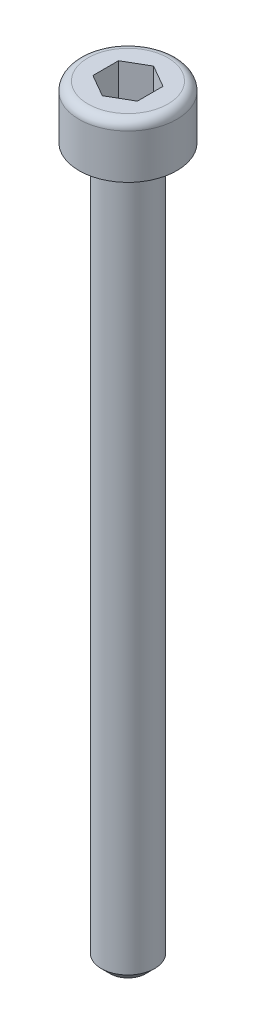
ISO-10303-21;
HEADER;
FILE_DESCRIPTION(('STEP AP214'),'2;1');
FILE_NAME('part.step','',(''),(''),'','','');
FILE_SCHEMA(('AUTOMOTIVE_DESIGN { 1 0 10303 214 1 1 1 1 }'));
ENDSEC;
DATA;
#1=APPLICATION_CONTEXT('core data for automotive mechanical design processes');
#2=APPLICATION_PROTOCOL_DEFINITION('international standard','automotive_design',2000,#1);
#3=PRODUCT_CONTEXT('',#1,'mechanical');
#4=PRODUCT('Part','Part','',(#3));
#5=PRODUCT_RELATED_PRODUCT_CATEGORY('part','',(#4));
#6=PRODUCT_DEFINITION_FORMATION('','',#4);
#7=PRODUCT_DEFINITION_CONTEXT('part definition',#1,'design');
#8=PRODUCT_DEFINITION('design','',#6,#7);
#9=PRODUCT_DEFINITION_SHAPE('','',#8);
#10=(LENGTH_UNIT() NAMED_UNIT(*) SI_UNIT(.MILLI.,.METRE.));
#11=(NAMED_UNIT(*) PLANE_ANGLE_UNIT() SI_UNIT($,.RADIAN.));
#12=(NAMED_UNIT(*) SI_UNIT($,.STERADIAN.) SOLID_ANGLE_UNIT());
#13=UNCERTAINTY_MEASURE_WITH_UNIT(LENGTH_MEASURE(1.E-05),#10,'distance_accuracy_value','');
#14=(GEOMETRIC_REPRESENTATION_CONTEXT(3) GLOBAL_UNCERTAINTY_ASSIGNED_CONTEXT((#13)) GLOBAL_UNIT_ASSIGNED_CONTEXT((#10,
#11,#12)) REPRESENTATION_CONTEXT('',''));
#15=CARTESIAN_POINT('',(0.,0.,0.));
#16=DIRECTION('',(0.,0.,1.));
#17=DIRECTION('',(1.,0.,0.));
#18=AXIS2_PLACEMENT_3D('',#15,#16,#17);
#19=CARTESIAN_POINT('',(0.,0.,0.));
#20=DIRECTION('',(0.,-1.,0.));
#21=DIRECTION('',(0.,0.,-1.));
#22=AXIS2_PLACEMENT_3D('',#19,#20,#21);
#23=PLANE('',#22);
#24=CARTESIAN_POINT('',(0.,0.,0.));
#25=DIRECTION('',(0.,-1.,0.));
#26=DIRECTION('',(0.,0.,-1.));
#27=AXIS2_PLACEMENT_3D('',#24,#25,#26);
#28=CIRCLE('',#27,2.25);
#29=CARTESIAN_POINT('',(0.,0.,-2.25));
#30=VERTEX_POINT('',#29);
#31=EDGE_CURVE('E42',#30,#30,#28,.F.);
#32=ORIENTED_EDGE('',*,*,#31,.T.);
#33=EDGE_LOOP('',(#32));
#34=FACE_BOUND('',#33,.T.);
#35=DIRECTION('',(-0.866025403784439,0.,-0.5));
#36=VECTOR('',#35,1.);
#37=CARTESIAN_POINT('',(1.25,0.,-0.721687836487032));
#38=LINE('',#37,#36);
#39=CARTESIAN_POINT('',(1.25,0.,-0.721687836487032));
#40=VERTEX_POINT('',#39);
#41=CARTESIAN_POINT('',(0.,0.,-1.44337567297406));
#42=VERTEX_POINT('',#41);
#43=EDGE_CURVE('E123',#40,#42,#38,.T.);
#44=ORIENTED_EDGE('',*,*,#43,.F.);
#45=DIRECTION('',(0.,0.,-1.));
#46=VECTOR('',#45,1.);
#47=CARTESIAN_POINT('',(1.25,0.,0.721687836487033));
#48=LINE('',#47,#46);
#49=CARTESIAN_POINT('',(1.25,0.,0.721687836487033));
#50=VERTEX_POINT('',#49);
#51=EDGE_CURVE('E49',#50,#40,#48,.T.);
#52=ORIENTED_EDGE('',*,*,#51,.F.);
#53=DIRECTION('',(0.866025403784439,0.,-0.5));
#54=VECTOR('',#53,1.);
#55=CARTESIAN_POINT('',(0.,0.,1.44337567297406));
#56=LINE('',#55,#54);
#57=CARTESIAN_POINT('',(0.,0.,1.44337567297406));
#58=VERTEX_POINT('',#57);
#59=EDGE_CURVE('E132',#58,#50,#56,.T.);
#60=ORIENTED_EDGE('',*,*,#59,.F.);
#61=DIRECTION('',(0.866025403784439,0.,0.5));
#62=VECTOR('',#61,1.);
#63=CARTESIAN_POINT('',(-1.25,0.,0.721687836487031));
#64=LINE('',#63,#62);
#65=CARTESIAN_POINT('',(-1.25,0.,0.721687836487031));
#66=VERTEX_POINT('',#65);
#67=EDGE_CURVE('E130',#66,#58,#64,.T.);
#68=ORIENTED_EDGE('',*,*,#67,.F.);
#69=DIRECTION('',(0.,0.,1.));
#70=VECTOR('',#69,1.);
#71=CARTESIAN_POINT('',(-1.25,0.,-0.721687836487033));
#72=LINE('',#71,#70);
#73=CARTESIAN_POINT('',(-1.25,0.,-0.721687836487033));
#74=VERTEX_POINT('',#73);
#75=EDGE_CURVE('E97',#74,#66,#72,.T.);
#76=ORIENTED_EDGE('',*,*,#75,.F.);
#77=DIRECTION('',(-0.866025403784439,0.,0.5));
#78=VECTOR('',#77,1.);
#79=CARTESIAN_POINT('',(0.,0.,-1.44337567297406));
#80=LINE('',#79,#78);
#81=EDGE_CURVE('E126',#42,#74,#80,.T.);
#82=ORIENTED_EDGE('',*,*,#81,.F.);
#83=EDGE_LOOP('',(#44,#52,#60,#68,#76,#82));
#84=FACE_BOUND('',#83,.T.);
#85=ADVANCED_FACE('F34',(#34,#84),#23,.F.);
#86=CARTESIAN_POINT('',(0.,0.,0.));
#87=DIRECTION('',(0.,1.,0.));
#88=DIRECTION('',(0.,0.,1.));
#89=AXIS2_PLACEMENT_3D('',#86,#87,#88);
#90=CYLINDRICAL_SURFACE('',#89,2.75);
#91=CARTESIAN_POINT('',(0.,-0.5,0.));
#92=DIRECTION('',(0.,-1.,0.));
#93=DIRECTION('',(0.,0.,-1.));
#94=AXIS2_PLACEMENT_3D('',#91,#92,#93);
#95=CIRCLE('',#94,2.75);
#96=CARTESIAN_POINT('',(0.,-0.5,-2.75));
#97=VERTEX_POINT('',#96);
#98=EDGE_CURVE('E11',#97,#97,#95,.T.);
#99=ORIENTED_EDGE('',*,*,#98,.T.);
#100=EDGE_LOOP('',(#99));
#101=FACE_BOUND('',#100,.T.);
#102=CARTESIAN_POINT('',(0.,-3.,0.));
#103=DIRECTION('',(0.,1.,0.));
#104=DIRECTION('',(0.,0.,1.));
#105=AXIS2_PLACEMENT_3D('',#102,#103,#104);
#106=CIRCLE('',#105,2.75);
#107=CARTESIAN_POINT('',(0.,-3.,2.75));
#108=VERTEX_POINT('',#107);
#109=EDGE_CURVE('E144',#108,#108,#106,.T.);
#110=ORIENTED_EDGE('',*,*,#109,.T.);
#111=EDGE_LOOP('',(#110));
#112=FACE_BOUND('',#111,.T.);
#113=ADVANCED_FACE('F166',(#101,#112),#90,.T.);
#114=CARTESIAN_POINT('',(2.75,-3.,0.));
#115=DIRECTION('',(0.,1.,0.));
#116=DIRECTION('',(0.,0.,1.));
#117=AXIS2_PLACEMENT_3D('',#114,#115,#116);
#118=PLANE('',#117);
#119=ORIENTED_EDGE('',*,*,#109,.F.);
#120=EDGE_LOOP('',(#119));
#121=FACE_BOUND('',#120,.T.);
#122=CARTESIAN_POINT('',(0.,-3.,0.));
#123=DIRECTION('',(0.,1.,0.));
#124=DIRECTION('',(0.,0.,1.));
#125=AXIS2_PLACEMENT_3D('',#122,#123,#124);
#126=CIRCLE('',#125,1.5);
#127=CARTESIAN_POINT('',(0.,-3.,1.5));
#128=VERTEX_POINT('',#127);
#129=EDGE_CURVE('E136',#128,#128,#126,.T.);
#130=ORIENTED_EDGE('',*,*,#129,.T.);
#131=EDGE_LOOP('',(#130));
#132=FACE_BOUND('',#131,.T.);
#133=ADVANCED_FACE('F171',(#121,#132),#118,.F.);
#134=CARTESIAN_POINT('',(0.,0.,0.));
#135=DIRECTION('',(0.,1.,0.));
#136=DIRECTION('',(0.,0.,1.));
#137=AXIS2_PLACEMENT_3D('',#134,#135,#136);
#138=CYLINDRICAL_SURFACE('',#137,1.5);
#139=CARTESIAN_POINT('',(0.,-42.5,0.));
#140=DIRECTION('',(0.,1.,0.));
#141=DIRECTION('',(0.,0.,1.));
#142=AXIS2_PLACEMENT_3D('',#139,#140,#141);
#143=CIRCLE('',#142,1.5);
#144=CARTESIAN_POINT('',(0.,-42.5,1.5));
#145=VERTEX_POINT('',#144);
#146=EDGE_CURVE('E147',#145,#145,#143,.T.);
#147=ORIENTED_EDGE('',*,*,#146,.T.);
#148=EDGE_LOOP('',(#147));
#149=FACE_BOUND('',#148,.T.);
#150=ORIENTED_EDGE('',*,*,#129,.F.);
#151=EDGE_LOOP('',(#150));
#152=FACE_BOUND('',#151,.T.);
#153=ADVANCED_FACE('F177',(#149,#152),#138,.T.);
#154=CARTESIAN_POINT('',(1.50000000000001,-43.,0.));
#155=DIRECTION('',(0.,1.,0.));
#156=DIRECTION('',(0.,0.,1.));
#157=AXIS2_PLACEMENT_3D('',#154,#155,#156);
#158=PLANE('',#157);
#159=CARTESIAN_POINT('',(0.,-43.,0.));
#160=DIRECTION('',(0.,1.,0.));
#161=DIRECTION('',(0.,0.,1.));
#162=AXIS2_PLACEMENT_3D('',#159,#160,#161);
#163=CIRCLE('',#162,1.);
#164=CARTESIAN_POINT('',(0.,-43.,1.));
#165=VERTEX_POINT('',#164);
#166=EDGE_CURVE('E150',#165,#165,#163,.F.);
#167=ORIENTED_EDGE('',*,*,#166,.T.);
#168=EDGE_LOOP('',(#167));
#169=FACE_BOUND('',#168,.T.);
#170=ADVANCED_FACE('F181',(#169),#158,.F.);
#171=CARTESIAN_POINT('',(1.25,-2.,0.721687836487033));
#172=DIRECTION('',(1.,0.,0.));
#173=DIRECTION('',(0.,0.,-1.));
#174=AXIS2_PLACEMENT_3D('',#171,#172,#173);
#175=PLANE('',#174);
#176=ORIENTED_EDGE('',*,*,#51,.T.);
#177=DIRECTION('',(0.,1.,0.));
#178=VECTOR('',#177,1.);
#179=CARTESIAN_POINT('',(1.25,-2.,-0.721687836487032));
#180=LINE('',#179,#178);
#181=CARTESIAN_POINT('',(1.25,-2.,-0.721687836487032));
#182=VERTEX_POINT('',#181);
#183=EDGE_CURVE('E79',#182,#40,#180,.T.);
#184=ORIENTED_EDGE('',*,*,#183,.F.);
#185=DIRECTION('',(0.,0.,-1.));
#186=VECTOR('',#185,1.);
#187=CARTESIAN_POINT('',(1.25,-2.,0.721687836487033));
#188=LINE('',#187,#186);
#189=CARTESIAN_POINT('',(1.25,-2.,0.721687836487033));
#190=VERTEX_POINT('',#189);
#191=EDGE_CURVE('E134',#190,#182,#188,.T.);
#192=ORIENTED_EDGE('',*,*,#191,.F.);
#193=DIRECTION('',(0.,1.,0.));
#194=VECTOR('',#193,1.);
#195=CARTESIAN_POINT('',(1.25,-2.,0.721687836487033));
#196=LINE('',#195,#194);
#197=EDGE_CURVE('E57',#190,#50,#196,.T.);
#198=ORIENTED_EDGE('',*,*,#197,.T.);
#199=EDGE_LOOP('',(#176,#184,#192,#198));
#200=FACE_BOUND('',#199,.T.);
#201=ADVANCED_FACE('F185',(#200),#175,.F.);
#202=CARTESIAN_POINT('',(0.,-2.,1.44337567297406));
#203=DIRECTION('',(0.5,0.,0.866025403784439));
#204=DIRECTION('',(0.866025403784439,0.,-0.5));
#205=AXIS2_PLACEMENT_3D('',#202,#203,#204);
#206=PLANE('',#205);
#207=ORIENTED_EDGE('',*,*,#59,.T.);
#208=ORIENTED_EDGE('',*,*,#197,.F.);
#209=DIRECTION('',(0.866025403784439,0.,-0.5));
#210=VECTOR('',#209,1.);
#211=CARTESIAN_POINT('',(0.,-2.,1.44337567297406));
#212=LINE('',#211,#210);
#213=CARTESIAN_POINT('',(0.,-2.,1.44337567297406));
#214=VERTEX_POINT('',#213);
#215=EDGE_CURVE('E109',#214,#190,#212,.T.);
#216=ORIENTED_EDGE('',*,*,#215,.F.);
#217=DIRECTION('',(0.,1.,0.));
#218=VECTOR('',#217,1.);
#219=CARTESIAN_POINT('',(0.,-2.,1.44337567297406));
#220=LINE('',#219,#218);
#221=EDGE_CURVE('E101',#214,#58,#220,.T.);
#222=ORIENTED_EDGE('',*,*,#221,.T.);
#223=EDGE_LOOP('',(#207,#208,#216,#222));
#224=FACE_BOUND('',#223,.T.);
#225=ADVANCED_FACE('F189',(#224),#206,.F.);
#226=CARTESIAN_POINT('',(-1.25,-2.,0.721687836487031));
#227=DIRECTION('',(-0.5,0.,0.866025403784439));
#228=DIRECTION('',(0.866025403784439,0.,0.5));
#229=AXIS2_PLACEMENT_3D('',#226,#227,#228);
#230=PLANE('',#229);
#231=ORIENTED_EDGE('',*,*,#67,.T.);
#232=ORIENTED_EDGE('',*,*,#221,.F.);
#233=DIRECTION('',(0.866025403784439,0.,0.5));
#234=VECTOR('',#233,1.);
#235=CARTESIAN_POINT('',(-1.25,-2.,0.721687836487031));
#236=LINE('',#235,#234);
#237=CARTESIAN_POINT('',(-1.25,-2.,0.721687836487031));
#238=VERTEX_POINT('',#237);
#239=EDGE_CURVE('E105',#238,#214,#236,.T.);
#240=ORIENTED_EDGE('',*,*,#239,.F.);
#241=DIRECTION('',(0.,1.,0.));
#242=VECTOR('',#241,1.);
#243=CARTESIAN_POINT('',(-1.25,-2.,0.721687836487031));
#244=LINE('',#243,#242);
#245=EDGE_CURVE('E90',#238,#66,#244,.T.);
#246=ORIENTED_EDGE('',*,*,#245,.T.);
#247=EDGE_LOOP('',(#231,#232,#240,#246));
#248=FACE_BOUND('',#247,.T.);
#249=ADVANCED_FACE('F106',(#248),#230,.F.);
#250=CARTESIAN_POINT('',(-1.25,-2.,-0.721687836487033));
#251=DIRECTION('',(-1.,0.,0.));
#252=DIRECTION('',(0.,0.,1.));
#253=AXIS2_PLACEMENT_3D('',#250,#251,#252);
#254=PLANE('',#253);
#255=ORIENTED_EDGE('',*,*,#75,.T.);
#256=ORIENTED_EDGE('',*,*,#245,.F.);
#257=DIRECTION('',(0.,0.,1.));
#258=VECTOR('',#257,1.);
#259=CARTESIAN_POINT('',(-1.25,-2.,-0.721687836487033));
#260=LINE('',#259,#258);
#261=CARTESIAN_POINT('',(-1.25,-2.,-0.721687836487033));
#262=VERTEX_POINT('',#261);
#263=EDGE_CURVE('E94',#262,#238,#260,.T.);
#264=ORIENTED_EDGE('',*,*,#263,.F.);
#265=DIRECTION('',(0.,1.,0.));
#266=VECTOR('',#265,1.);
#267=CARTESIAN_POINT('',(-1.25,-2.,-0.721687836487033));
#268=LINE('',#267,#266);
#269=EDGE_CURVE('E102',#262,#74,#268,.T.);
#270=ORIENTED_EDGE('',*,*,#269,.T.);
#271=EDGE_LOOP('',(#255,#256,#264,#270));
#272=FACE_BOUND('',#271,.T.);
#273=ADVANCED_FACE('F92',(#272),#254,.F.);
#274=CARTESIAN_POINT('',(0.,-2.,-1.44337567297406));
#275=DIRECTION('',(-0.5,0.,-0.866025403784439));
#276=DIRECTION('',(-0.866025403784439,0.,0.5));
#277=AXIS2_PLACEMENT_3D('',#274,#275,#276);
#278=PLANE('',#277);
#279=ORIENTED_EDGE('',*,*,#81,.T.);
#280=ORIENTED_EDGE('',*,*,#269,.F.);
#281=DIRECTION('',(-0.866025403784439,0.,0.5));
#282=VECTOR('',#281,1.);
#283=CARTESIAN_POINT('',(0.,-2.,-1.44337567297406));
#284=LINE('',#283,#282);
#285=CARTESIAN_POINT('',(0.,-2.,-1.44337567297406));
#286=VERTEX_POINT('',#285);
#287=EDGE_CURVE('E115',#286,#262,#284,.T.);
#288=ORIENTED_EDGE('',*,*,#287,.F.);
#289=DIRECTION('',(0.,1.,0.));
#290=VECTOR('',#289,1.);
#291=CARTESIAN_POINT('',(0.,-2.,-1.44337567297406));
#292=LINE('',#291,#290);
#293=EDGE_CURVE('E139',#286,#42,#292,.T.);
#294=ORIENTED_EDGE('',*,*,#293,.T.);
#295=EDGE_LOOP('',(#279,#280,#288,#294));
#296=FACE_BOUND('',#295,.T.);
#297=ADVANCED_FACE('F193',(#296),#278,.F.);
#298=CARTESIAN_POINT('',(1.25,-2.,-0.721687836487032));
#299=DIRECTION('',(0.5,0.,-0.866025403784439));
#300=DIRECTION('',(-0.866025403784439,0.,-0.5));
#301=AXIS2_PLACEMENT_3D('',#298,#299,#300);
#302=PLANE('',#301);
#303=ORIENTED_EDGE('',*,*,#43,.T.);
#304=ORIENTED_EDGE('',*,*,#293,.F.);
#305=DIRECTION('',(-0.866025403784439,0.,-0.5));
#306=VECTOR('',#305,1.);
#307=CARTESIAN_POINT('',(1.25,-2.,-0.721687836487032));
#308=LINE('',#307,#306);
#309=EDGE_CURVE('E117',#182,#286,#308,.T.);
#310=ORIENTED_EDGE('',*,*,#309,.F.);
#311=ORIENTED_EDGE('',*,*,#183,.T.);
#312=EDGE_LOOP('',(#303,#304,#310,#311));
#313=FACE_BOUND('',#312,.T.);
#314=ADVANCED_FACE('F190',(#313),#302,.F.);
#315=CARTESIAN_POINT('',(1.25,-2.,-0.721687836487032));
#316=DIRECTION('',(0.,1.,0.));
#317=DIRECTION('',(0.,0.,1.));
#318=AXIS2_PLACEMENT_3D('',#315,#316,#317);
#319=PLANE('',#318);
#320=ORIENTED_EDGE('',*,*,#191,.T.);
#321=ORIENTED_EDGE('',*,*,#309,.T.);
#322=ORIENTED_EDGE('',*,*,#287,.T.);
#323=ORIENTED_EDGE('',*,*,#263,.T.);
#324=ORIENTED_EDGE('',*,*,#239,.T.);
#325=ORIENTED_EDGE('',*,*,#215,.T.);
#326=EDGE_LOOP('',(#320,#321,#322,#323,#324,#325));
#327=FACE_BOUND('',#326,.T.);
#328=ADVANCED_FACE('F112',(#327),#319,.T.);
#329=CARTESIAN_POINT('',(0.,-42.5,0.));
#330=DIRECTION('',(0.,1.,0.));
#331=DIRECTION('',(0.,0.,1.));
#332=AXIS2_PLACEMENT_3D('',#329,#330,#331);
#333=CONICAL_SURFACE('',#332,1.5,0.785398163397439);
#334=ORIENTED_EDGE('',*,*,#166,.F.);
#335=EDGE_LOOP('',(#334));
#336=FACE_BOUND('',#335,.T.);
#337=ORIENTED_EDGE('',*,*,#146,.F.);
#338=EDGE_LOOP('',(#337));
#339=FACE_BOUND('',#338,.T.);
#340=ADVANCED_FACE('F158',(#336,#339),#333,.T.);
#341=CARTESIAN_POINT('',(0.,-0.5,0.));
#342=DIRECTION('',(0.,-1.,0.));
#343=DIRECTION('',(0.,0.,-1.));
#344=AXIS2_PLACEMENT_3D('',#341,#342,#343);
#345=TOROIDAL_SURFACE('',#344,2.25,0.5);
#346=ORIENTED_EDGE('',*,*,#98,.F.);
#347=EDGE_LOOP('',(#346));
#348=FACE_BOUND('',#347,.T.);
#349=ORIENTED_EDGE('',*,*,#31,.F.);
#350=EDGE_LOOP('',(#349));
#351=FACE_BOUND('',#350,.T.);
#352=ADVANCED_FACE('F36',(#348,#351),#345,.T.);
#353=CLOSED_SHELL('',(#85,#113,#133,#153,#170,#201,#225,#249,#273,#297,#314,#328,#340,#352));
#354=MANIFOLD_SOLID_BREP('B2',#353);
#355=ADVANCED_BREP_SHAPE_REPRESENTATION('',(#18,#354),#14);
#356=SHAPE_DEFINITION_REPRESENTATION(#9,#355);
ENDSEC;
END-ISO-10303-21;
